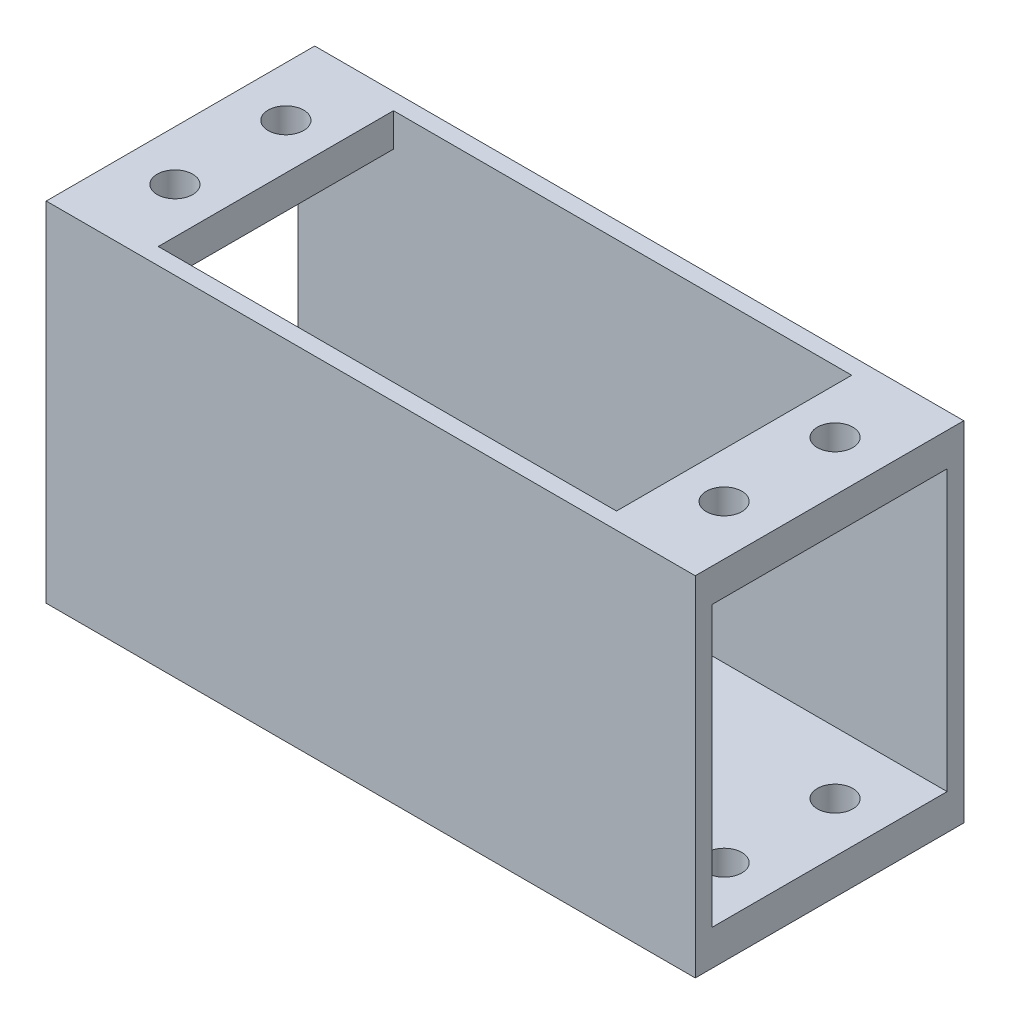
ISO-10303-21;
HEADER;
FILE_DESCRIPTION(('STEP AP214'),'2;1');
FILE_NAME('part.step','',(''),(''),'','','');
FILE_SCHEMA(('AUTOMOTIVE_DESIGN { 1 0 10303 214 1 1 1 1 }'));
ENDSEC;
DATA;
#1=APPLICATION_CONTEXT('core data for automotive mechanical design processes');
#2=APPLICATION_PROTOCOL_DEFINITION('international standard','automotive_design',2000,#1);
#3=PRODUCT_CONTEXT('',#1,'mechanical');
#4=PRODUCT('Part','Part','',(#3));
#5=PRODUCT_RELATED_PRODUCT_CATEGORY('part','',(#4));
#6=PRODUCT_DEFINITION_FORMATION('','',#4);
#7=PRODUCT_DEFINITION_CONTEXT('part definition',#1,'design');
#8=PRODUCT_DEFINITION('design','',#6,#7);
#9=PRODUCT_DEFINITION_SHAPE('','',#8);
#10=(LENGTH_UNIT() NAMED_UNIT(*) SI_UNIT(.MILLI.,.METRE.));
#11=(NAMED_UNIT(*) PLANE_ANGLE_UNIT() SI_UNIT($,.RADIAN.));
#12=(NAMED_UNIT(*) SI_UNIT($,.STERADIAN.) SOLID_ANGLE_UNIT());
#13=UNCERTAINTY_MEASURE_WITH_UNIT(LENGTH_MEASURE(1.E-05),#10,'distance_accuracy_value','');
#14=(GEOMETRIC_REPRESENTATION_CONTEXT(3) GLOBAL_UNCERTAINTY_ASSIGNED_CONTEXT((#13)) GLOBAL_UNIT_ASSIGNED_CONTEXT((#10,
#11,#12)) REPRESENTATION_CONTEXT('',''));
#15=CARTESIAN_POINT('',(0.,0.,0.));
#16=DIRECTION('',(0.,0.,1.));
#17=DIRECTION('',(1.,0.,0.));
#18=AXIS2_PLACEMENT_3D('',#15,#16,#17);
#19=CARTESIAN_POINT('',(-19.15,13.,10.6));
#20=DIRECTION('',(0.,0.,-1.));
#21=DIRECTION('',(-1.,0.,0.));
#22=AXIS2_PLACEMENT_3D('',#19,#20,#21);
#23=PLANE('',#22);
#24=DIRECTION('',(0.,-1.,0.));
#25=VECTOR('',#24,1.);
#26=CARTESIAN_POINT('',(4.45982062419555,-500.,10.6));
#27=LINE('',#26,#25);
#28=CARTESIAN_POINT('',(4.45982062419555,18.,10.6));
#29=VERTEX_POINT('',#28);
#30=CARTESIAN_POINT('',(4.45982062419555,13.,10.6));
#31=VERTEX_POINT('',#30);
#32=EDGE_CURVE('E211',#29,#31,#27,.T.);
#33=ORIENTED_EDGE('',*,*,#32,.F.);
#34=DIRECTION('',(1.,0.,0.));
#35=VECTOR('',#34,1.);
#36=CARTESIAN_POINT('',(-19.15,18.,10.6));
#37=LINE('',#36,#35);
#38=CARTESIAN_POINT('',(-4.45982062419555,18.,10.6));
#39=VERTEX_POINT('',#38);
#40=EDGE_CURVE('E337',#39,#29,#37,.T.);
#41=ORIENTED_EDGE('',*,*,#40,.F.);
#42=DIRECTION('',(0.,-1.,0.));
#43=VECTOR('',#42,1.);
#44=CARTESIAN_POINT('',(-4.45982062419555,-500.,10.6));
#45=LINE('',#44,#43);
#46=CARTESIAN_POINT('',(-4.45982062419555,13.,10.6));
#47=VERTEX_POINT('',#46);
#48=EDGE_CURVE('E332',#47,#39,#45,.F.);
#49=ORIENTED_EDGE('',*,*,#48,.F.);
#50=DIRECTION('',(1.,0.,0.));
#51=VECTOR('',#50,1.);
#52=CARTESIAN_POINT('',(-19.15,13.,10.6));
#53=LINE('',#52,#51);
#54=CARTESIAN_POINT('',(-19.15,13.,10.6));
#55=VERTEX_POINT('',#54);
#56=EDGE_CURVE('E185',#55,#47,#53,.T.);
#57=ORIENTED_EDGE('',*,*,#56,.F.);
#58=DIRECTION('',(0.,1.,0.));
#59=VECTOR('',#58,1.);
#60=CARTESIAN_POINT('',(-19.15,13.,10.6));
#61=LINE('',#60,#59);
#62=CARTESIAN_POINT('',(-19.15,38.2,10.6));
#63=VERTEX_POINT('',#62);
#64=EDGE_CURVE('E188',#55,#63,#61,.T.);
#65=ORIENTED_EDGE('',*,*,#64,.T.);
#66=DIRECTION('',(1.,0.,0.));
#67=VECTOR('',#66,1.);
#68=CARTESIAN_POINT('',(-19.15,38.2,10.6));
#69=LINE('',#68,#67);
#70=CARTESIAN_POINT('',(-10.55,38.2,10.6));
#71=VERTEX_POINT('',#70);
#72=EDGE_CURVE('E298',#63,#71,#69,.T.);
#73=ORIENTED_EDGE('',*,*,#72,.T.);
#74=DIRECTION('',(0.,1.,0.));
#75=VECTOR('',#74,1.);
#76=CARTESIAN_POINT('',(-10.55,38.2,10.6));
#77=LINE('',#76,#75);
#78=CARTESIAN_POINT('',(-10.55,41.2,10.6));
#79=VERTEX_POINT('',#78);
#80=EDGE_CURVE('E292',#71,#79,#77,.T.);
#81=ORIENTED_EDGE('',*,*,#80,.T.);
#82=DIRECTION('',(1.,0.,0.));
#83=VECTOR('',#82,1.);
#84=CARTESIAN_POINT('',(-19.15,41.2,10.6));
#85=LINE('',#84,#83);
#86=CARTESIAN_POINT('',(30.75,41.2,10.6));
#87=VERTEX_POINT('',#86);
#88=EDGE_CURVE('E216',#79,#87,#85,.T.);
#89=ORIENTED_EDGE('',*,*,#88,.T.);
#90=DIRECTION('',(0.,-1.,0.));
#91=VECTOR('',#90,1.);
#92=CARTESIAN_POINT('',(30.75,41.2,10.6));
#93=LINE('',#92,#91);
#94=CARTESIAN_POINT('',(30.75,38.2,10.6));
#95=VERTEX_POINT('',#94);
#96=EDGE_CURVE('E264',#87,#95,#93,.T.);
#97=ORIENTED_EDGE('',*,*,#96,.T.);
#98=DIRECTION('',(1.,0.,0.));
#99=VECTOR('',#98,1.);
#100=CARTESIAN_POINT('',(30.75,38.2,10.6));
#101=LINE('',#100,#99);
#102=CARTESIAN_POINT('',(39.35,38.2,10.6));
#103=VERTEX_POINT('',#102);
#104=EDGE_CURVE('E262',#95,#103,#101,.T.);
#105=ORIENTED_EDGE('',*,*,#104,.T.);
#106=DIRECTION('',(0.,1.,0.));
#107=VECTOR('',#106,1.);
#108=CARTESIAN_POINT('',(39.35,13.,10.6));
#109=LINE('',#108,#107);
#110=CARTESIAN_POINT('',(39.35,13.,10.6));
#111=VERTEX_POINT('',#110);
#112=EDGE_CURVE('E243',#111,#103,#109,.T.);
#113=ORIENTED_EDGE('',*,*,#112,.F.);
#114=EDGE_CURVE('E180',#31,#111,#53,.T.);
#115=ORIENTED_EDGE('',*,*,#114,.F.);
#116=EDGE_LOOP('',(#33,#41,#49,#57,#65,#73,#81,#89,#97,#105,#113,#115));
#117=FACE_BOUND('',#116,.T.);
#118=ADVANCED_FACE('F41',(#117),#23,.T.);
#119=CARTESIAN_POINT('',(-19.15,41.2,12.1));
#120=DIRECTION('',(0.,0.,1.));
#121=DIRECTION('',(1.,0.,0.));
#122=AXIS2_PLACEMENT_3D('',#119,#120,#121);
#123=PLANE('',#122);
#124=DIRECTION('',(1.,0.,0.));
#125=VECTOR('',#124,1.);
#126=CARTESIAN_POINT('',(-19.15,9.8,12.1));
#127=LINE('',#126,#125);
#128=CARTESIAN_POINT('',(-19.15,9.8,12.1));
#129=VERTEX_POINT('',#128);
#130=CARTESIAN_POINT('',(39.35,9.8,12.1));
#131=VERTEX_POINT('',#130);
#132=EDGE_CURVE('E189',#129,#131,#127,.T.);
#133=ORIENTED_EDGE('',*,*,#132,.T.);
#134=DIRECTION('',(0.,-1.,0.));
#135=VECTOR('',#134,1.);
#136=CARTESIAN_POINT('',(39.35,41.2,12.1));
#137=LINE('',#136,#135);
#138=CARTESIAN_POINT('',(39.35,41.2,12.1));
#139=VERTEX_POINT('',#138);
#140=EDGE_CURVE('E260',#139,#131,#137,.T.);
#141=ORIENTED_EDGE('',*,*,#140,.F.);
#142=DIRECTION('',(1.,0.,0.));
#143=VECTOR('',#142,1.);
#144=CARTESIAN_POINT('',(-19.15,41.2,12.1));
#145=LINE('',#144,#143);
#146=CARTESIAN_POINT('',(-19.15,41.2,12.1));
#147=VERTEX_POINT('',#146);
#148=EDGE_CURVE('E213',#147,#139,#145,.T.);
#149=ORIENTED_EDGE('',*,*,#148,.F.);
#150=DIRECTION('',(0.,-1.,0.));
#151=VECTOR('',#150,1.);
#152=CARTESIAN_POINT('',(-19.15,41.2,12.1));
#153=LINE('',#152,#151);
#154=EDGE_CURVE('E239',#147,#129,#153,.T.);
#155=ORIENTED_EDGE('',*,*,#154,.T.);
#156=EDGE_LOOP('',(#133,#141,#149,#155));
#157=FACE_BOUND('',#156,.T.);
#158=ADVANCED_FACE('F43',(#157),#123,.T.);
#159=CARTESIAN_POINT('',(-19.15,41.2,10.6));
#160=DIRECTION('',(0.,1.,0.));
#161=DIRECTION('',(0.,0.,1.));
#162=AXIS2_PLACEMENT_3D('',#159,#160,#161);
#163=PLANE('',#162);
#164=CARTESIAN_POINT('',(-14.65,41.2,-5.));
#165=DIRECTION('',(0.,1.,0.));
#166=DIRECTION('',(0.,0.,1.));
#167=AXIS2_PLACEMENT_3D('',#164,#165,#166);
#168=CIRCLE('',#167,1.6);
#169=CARTESIAN_POINT('',(-14.65,41.2,-3.4));
#170=VERTEX_POINT('',#169);
#171=EDGE_CURVE('E204',#170,#170,#168,.T.);
#172=ORIENTED_EDGE('',*,*,#171,.F.);
#173=EDGE_LOOP('',(#172));
#174=FACE_BOUND('',#173,.T.);
#175=CARTESIAN_POINT('',(34.85,41.2,5.));
#176=DIRECTION('',(0.,1.,0.));
#177=DIRECTION('',(0.,0.,1.));
#178=AXIS2_PLACEMENT_3D('',#175,#176,#177);
#179=CIRCLE('',#178,1.6);
#180=CARTESIAN_POINT('',(34.85,41.2,6.6));
#181=VERTEX_POINT('',#180);
#182=EDGE_CURVE('E285',#181,#181,#179,.T.);
#183=ORIENTED_EDGE('',*,*,#182,.F.);
#184=EDGE_LOOP('',(#183));
#185=FACE_BOUND('',#184,.T.);
#186=CARTESIAN_POINT('',(34.85,41.2,-5.));
#187=DIRECTION('',(0.,1.,0.));
#188=DIRECTION('',(0.,0.,1.));
#189=AXIS2_PLACEMENT_3D('',#186,#187,#188);
#190=CIRCLE('',#189,1.6);
#191=CARTESIAN_POINT('',(34.85,41.2,-3.4));
#192=VERTEX_POINT('',#191);
#193=EDGE_CURVE('E208',#192,#192,#190,.T.);
#194=ORIENTED_EDGE('',*,*,#193,.F.);
#195=EDGE_LOOP('',(#194));
#196=FACE_BOUND('',#195,.T.);
#197=CARTESIAN_POINT('',(-14.65,41.2,5.));
#198=DIRECTION('',(0.,1.,0.));
#199=DIRECTION('',(0.,0.,1.));
#200=AXIS2_PLACEMENT_3D('',#197,#198,#199);
#201=CIRCLE('',#200,1.6);
#202=CARTESIAN_POINT('',(-14.65,41.2,6.6));
#203=VERTEX_POINT('',#202);
#204=EDGE_CURVE('E197',#203,#203,#201,.T.);
#205=ORIENTED_EDGE('',*,*,#204,.F.);
#206=EDGE_LOOP('',(#205));
#207=FACE_BOUND('',#206,.T.);
#208=ORIENTED_EDGE('',*,*,#88,.F.);
#209=DIRECTION('',(0.,0.,-1.));
#210=VECTOR('',#209,1.);
#211=CARTESIAN_POINT('',(-10.55,41.2,10.6));
#212=LINE('',#211,#210);
#213=CARTESIAN_POINT('',(-10.55,41.2,-10.6));
#214=VERTEX_POINT('',#213);
#215=EDGE_CURVE('E287',#79,#214,#212,.T.);
#216=ORIENTED_EDGE('',*,*,#215,.T.);
#217=DIRECTION('',(1.,0.,0.));
#218=VECTOR('',#217,1.);
#219=CARTESIAN_POINT('',(-19.15,41.2,-10.6));
#220=LINE('',#219,#218);
#221=CARTESIAN_POINT('',(30.75,41.2,-10.6));
#222=VERTEX_POINT('',#221);
#223=EDGE_CURVE('E174',#214,#222,#220,.T.);
#224=ORIENTED_EDGE('',*,*,#223,.T.);
#225=DIRECTION('',(0.,0.,-1.));
#226=VECTOR('',#225,1.);
#227=CARTESIAN_POINT('',(30.75,41.2,10.6));
#228=LINE('',#227,#226);
#229=EDGE_CURVE('E266',#87,#222,#228,.T.);
#230=ORIENTED_EDGE('',*,*,#229,.F.);
#231=EDGE_LOOP('',(#208,#216,#224,#230));
#232=FACE_BOUND('',#231,.T.);
#233=ORIENTED_EDGE('',*,*,#148,.T.);
#234=DIRECTION('',(0.,0.,1.));
#235=VECTOR('',#234,1.);
#236=CARTESIAN_POINT('',(39.35,41.2,-12.1));
#237=LINE('',#236,#235);
#238=CARTESIAN_POINT('',(39.35,41.2,-12.1));
#239=VERTEX_POINT('',#238);
#240=EDGE_CURVE('E248',#239,#139,#237,.T.);
#241=ORIENTED_EDGE('',*,*,#240,.F.);
#242=DIRECTION('',(1.,0.,0.));
#243=VECTOR('',#242,1.);
#244=CARTESIAN_POINT('',(-19.15,41.2,-12.1));
#245=LINE('',#244,#243);
#246=CARTESIAN_POINT('',(-19.15,41.2,-12.1));
#247=VERTEX_POINT('',#246);
#248=EDGE_CURVE('E177',#247,#239,#245,.T.);
#249=ORIENTED_EDGE('',*,*,#248,.F.);
#250=DIRECTION('',(0.,0.,1.));
#251=VECTOR('',#250,1.);
#252=CARTESIAN_POINT('',(-19.15,41.2,-12.1));
#253=LINE('',#252,#251);
#254=EDGE_CURVE('E235',#247,#147,#253,.T.);
#255=ORIENTED_EDGE('',*,*,#254,.T.);
#256=EDGE_LOOP('',(#233,#241,#249,#255));
#257=FACE_BOUND('',#256,.T.);
#258=ADVANCED_FACE('F360',(#174,#185,#196,#207,#232,#257),#163,.T.);
#259=CARTESIAN_POINT('',(-19.15,13.,-10.6));
#260=DIRECTION('',(0.,1.,0.));
#261=DIRECTION('',(0.,0.,1.));
#262=AXIS2_PLACEMENT_3D('',#259,#260,#261);
#263=PLANE('',#262);
#264=ORIENTED_EDGE('',*,*,#56,.T.);
#265=CARTESIAN_POINT('',(0.,13.,0.));
#266=DIRECTION('',(0.,-1.,0.));
#267=DIRECTION('',(0.,0.,-1.));
#268=AXIS2_PLACEMENT_3D('',#265,#266,#267);
#269=CIRCLE('',#268,11.5);
#270=EDGE_CURVE('E163',#31,#47,#269,.T.);
#271=ORIENTED_EDGE('',*,*,#270,.F.);
#272=ORIENTED_EDGE('',*,*,#114,.T.);
#273=DIRECTION('',(0.,0.,1.));
#274=VECTOR('',#273,1.);
#275=CARTESIAN_POINT('',(39.35,13.,-10.6));
#276=LINE('',#275,#274);
#277=CARTESIAN_POINT('',(39.35,13.,-10.6));
#278=VERTEX_POINT('',#277);
#279=EDGE_CURVE('E173',#278,#111,#276,.T.);
#280=ORIENTED_EDGE('',*,*,#279,.F.);
#281=DIRECTION('',(1.,0.,0.));
#282=VECTOR('',#281,1.);
#283=CARTESIAN_POINT('',(-19.15,13.,-10.6));
#284=LINE('',#283,#282);
#285=CARTESIAN_POINT('',(4.45982062419555,13.,-10.6));
#286=VERTEX_POINT('',#285);
#287=EDGE_CURVE('E164',#286,#278,#284,.T.);
#288=ORIENTED_EDGE('',*,*,#287,.F.);
#289=CARTESIAN_POINT('',(-4.45982062419555,13.,-10.6));
#290=VERTEX_POINT('',#289);
#291=EDGE_CURVE('E151',#290,#286,#269,.T.);
#292=ORIENTED_EDGE('',*,*,#291,.F.);
#293=CARTESIAN_POINT('',(-19.15,13.,-10.6));
#294=VERTEX_POINT('',#293);
#295=EDGE_CURVE('E172',#294,#290,#284,.T.);
#296=ORIENTED_EDGE('',*,*,#295,.F.);
#297=DIRECTION('',(0.,0.,1.));
#298=VECTOR('',#297,1.);
#299=CARTESIAN_POINT('',(-19.15,13.,-10.6));
#300=LINE('',#299,#298);
#301=EDGE_CURVE('E227',#294,#55,#300,.T.);
#302=ORIENTED_EDGE('',*,*,#301,.T.);
#303=EDGE_LOOP('',(#264,#271,#272,#280,#288,#292,#296,#302));
#304=FACE_BOUND('',#303,.T.);
#305=CARTESIAN_POINT('',(-14.65,13.,-5.));
#306=DIRECTION('',(0.,1.,0.));
#307=DIRECTION('',(0.,0.,1.));
#308=AXIS2_PLACEMENT_3D('',#305,#306,#307);
#309=CIRCLE('',#308,1.6);
#310=CARTESIAN_POINT('',(-14.65,13.,-3.4));
#311=VERTEX_POINT('',#310);
#312=EDGE_CURVE('E316',#311,#311,#309,.T.);
#313=ORIENTED_EDGE('',*,*,#312,.F.);
#314=EDGE_LOOP('',(#313));
#315=FACE_BOUND('',#314,.T.);
#316=CARTESIAN_POINT('',(-14.65,13.,5.));
#317=DIRECTION('',(0.,1.,0.));
#318=DIRECTION('',(0.,0.,1.));
#319=AXIS2_PLACEMENT_3D('',#316,#317,#318);
#320=CIRCLE('',#319,1.6);
#321=CARTESIAN_POINT('',(-14.65,13.,6.6));
#322=VERTEX_POINT('',#321);
#323=EDGE_CURVE('E329',#322,#322,#320,.T.);
#324=ORIENTED_EDGE('',*,*,#323,.F.);
#325=EDGE_LOOP('',(#324));
#326=FACE_BOUND('',#325,.T.);
#327=CARTESIAN_POINT('',(0.,13.,0.));
#328=DIRECTION('',(0.,1.,0.));
#329=DIRECTION('',(0.,0.,1.));
#330=AXIS2_PLACEMENT_3D('',#327,#328,#329);
#331=CIRCLE('',#330,7.7);
#332=CARTESIAN_POINT('',(0.,13.,7.7));
#333=VERTEX_POINT('',#332);
#334=EDGE_CURVE('E193',#333,#333,#331,.T.);
#335=ORIENTED_EDGE('',*,*,#334,.F.);
#336=EDGE_LOOP('',(#335));
#337=FACE_BOUND('',#336,.T.);
#338=CARTESIAN_POINT('',(34.85,13.,-5.));
#339=DIRECTION('',(0.,1.,0.));
#340=DIRECTION('',(0.,0.,1.));
#341=AXIS2_PLACEMENT_3D('',#338,#339,#340);
#342=CIRCLE('',#341,1.6);
#343=CARTESIAN_POINT('',(34.85,13.,-3.4));
#344=VERTEX_POINT('',#343);
#345=EDGE_CURVE('E315',#344,#344,#342,.T.);
#346=ORIENTED_EDGE('',*,*,#345,.F.);
#347=EDGE_LOOP('',(#346));
#348=FACE_BOUND('',#347,.T.);
#349=CARTESIAN_POINT('',(34.85,13.,5.));
#350=DIRECTION('',(0.,1.,0.));
#351=DIRECTION('',(0.,0.,1.));
#352=AXIS2_PLACEMENT_3D('',#349,#350,#351);
#353=CIRCLE('',#352,1.6);
#354=CARTESIAN_POINT('',(34.85,13.,6.6));
#355=VERTEX_POINT('',#354);
#356=EDGE_CURVE('E304',#355,#355,#353,.T.);
#357=ORIENTED_EDGE('',*,*,#356,.F.);
#358=EDGE_LOOP('',(#357));
#359=FACE_BOUND('',#358,.T.);
#360=ADVANCED_FACE('F167',(#304,#315,#326,#337,#348,#359),#263,.T.);
#361=CARTESIAN_POINT('',(-19.15,41.2,-10.6));
#362=DIRECTION('',(0.,0.,1.));
#363=DIRECTION('',(1.,0.,0.));
#364=AXIS2_PLACEMENT_3D('',#361,#362,#363);
#365=PLANE('',#364);
#366=DIRECTION('',(0.,-1.,0.));
#367=VECTOR('',#366,1.);
#368=CARTESIAN_POINT('',(-4.45982062419555,-500.,-10.6));
#369=LINE('',#368,#367);
#370=CARTESIAN_POINT('',(-4.45982062419555,18.,-10.6));
#371=VERTEX_POINT('',#370);
#372=EDGE_CURVE('E11',#371,#290,#369,.T.);
#373=ORIENTED_EDGE('',*,*,#372,.F.);
#374=DIRECTION('',(-1.,0.,0.));
#375=VECTOR('',#374,1.);
#376=CARTESIAN_POINT('',(-19.15,18.,-10.6));
#377=LINE('',#376,#375);
#378=CARTESIAN_POINT('',(4.45982062419555,18.,-10.6));
#379=VERTEX_POINT('',#378);
#380=EDGE_CURVE('E170',#379,#371,#377,.T.);
#381=ORIENTED_EDGE('',*,*,#380,.F.);
#382=DIRECTION('',(0.,-1.,0.));
#383=VECTOR('',#382,1.);
#384=CARTESIAN_POINT('',(4.45982062419555,-500.,-10.6));
#385=LINE('',#384,#383);
#386=EDGE_CURVE('E47',#286,#379,#385,.F.);
#387=ORIENTED_EDGE('',*,*,#386,.F.);
#388=ORIENTED_EDGE('',*,*,#287,.T.);
#389=DIRECTION('',(0.,-1.,0.));
#390=VECTOR('',#389,1.);
#391=CARTESIAN_POINT('',(39.35,41.2,-10.6));
#392=LINE('',#391,#390);
#393=CARTESIAN_POINT('',(39.35,38.2,-10.6));
#394=VERTEX_POINT('',#393);
#395=EDGE_CURVE('E250',#394,#278,#392,.T.);
#396=ORIENTED_EDGE('',*,*,#395,.F.);
#397=DIRECTION('',(1.,0.,0.));
#398=VECTOR('',#397,1.);
#399=CARTESIAN_POINT('',(30.75,38.2,-10.6));
#400=LINE('',#399,#398);
#401=CARTESIAN_POINT('',(30.75,38.2,-10.6));
#402=VERTEX_POINT('',#401);
#403=EDGE_CURVE('E263',#402,#394,#400,.T.);
#404=ORIENTED_EDGE('',*,*,#403,.F.);
#405=DIRECTION('',(0.,-1.,0.));
#406=VECTOR('',#405,1.);
#407=CARTESIAN_POINT('',(30.75,41.2,-10.6));
#408=LINE('',#407,#406);
#409=EDGE_CURVE('E267',#222,#402,#408,.T.);
#410=ORIENTED_EDGE('',*,*,#409,.F.);
#411=ORIENTED_EDGE('',*,*,#223,.F.);
#412=DIRECTION('',(0.,1.,0.));
#413=VECTOR('',#412,1.);
#414=CARTESIAN_POINT('',(-10.55,38.2,-10.6));
#415=LINE('',#414,#413);
#416=CARTESIAN_POINT('',(-10.55,38.2,-10.6));
#417=VERTEX_POINT('',#416);
#418=EDGE_CURVE('E291',#417,#214,#415,.T.);
#419=ORIENTED_EDGE('',*,*,#418,.F.);
#420=DIRECTION('',(1.,0.,0.));
#421=VECTOR('',#420,1.);
#422=CARTESIAN_POINT('',(-19.15,38.2,-10.6));
#423=LINE('',#422,#421);
#424=CARTESIAN_POINT('',(-19.15,38.2,-10.6));
#425=VERTEX_POINT('',#424);
#426=EDGE_CURVE('E275',#425,#417,#423,.T.);
#427=ORIENTED_EDGE('',*,*,#426,.F.);
#428=DIRECTION('',(0.,-1.,0.));
#429=VECTOR('',#428,1.);
#430=CARTESIAN_POINT('',(-19.15,41.2,-10.6));
#431=LINE('',#430,#429);
#432=EDGE_CURVE('E229',#425,#294,#431,.T.);
#433=ORIENTED_EDGE('',*,*,#432,.T.);
#434=ORIENTED_EDGE('',*,*,#295,.T.);
#435=EDGE_LOOP('',(#373,#381,#387,#388,#396,#404,#410,#411,#419,#427,#433,#434));
#436=FACE_BOUND('',#435,.T.);
#437=ADVANCED_FACE('F165',(#436),#365,.T.);
#438=CARTESIAN_POINT('',(-19.15,9.8,-12.1));
#439=DIRECTION('',(0.,0.,-1.));
#440=DIRECTION('',(-1.,0.,0.));
#441=AXIS2_PLACEMENT_3D('',#438,#439,#440);
#442=PLANE('',#441);
#443=ORIENTED_EDGE('',*,*,#248,.T.);
#444=DIRECTION('',(0.,1.,0.));
#445=VECTOR('',#444,1.);
#446=CARTESIAN_POINT('',(39.35,9.8,-12.1));
#447=LINE('',#446,#445);
#448=CARTESIAN_POINT('',(39.35,9.8,-12.1));
#449=VERTEX_POINT('',#448);
#450=EDGE_CURVE('E252',#449,#239,#447,.T.);
#451=ORIENTED_EDGE('',*,*,#450,.F.);
#452=DIRECTION('',(1.,0.,0.));
#453=VECTOR('',#452,1.);
#454=CARTESIAN_POINT('',(-19.15,9.8,-12.1));
#455=LINE('',#454,#453);
#456=CARTESIAN_POINT('',(-19.15,9.8,-12.1));
#457=VERTEX_POINT('',#456);
#458=EDGE_CURVE('E187',#457,#449,#455,.T.);
#459=ORIENTED_EDGE('',*,*,#458,.F.);
#460=DIRECTION('',(0.,1.,0.));
#461=VECTOR('',#460,1.);
#462=CARTESIAN_POINT('',(-19.15,9.8,-12.1));
#463=LINE('',#462,#461);
#464=EDGE_CURVE('E234',#457,#247,#463,.T.);
#465=ORIENTED_EDGE('',*,*,#464,.T.);
#466=EDGE_LOOP('',(#443,#451,#459,#465));
#467=FACE_BOUND('',#466,.T.);
#468=ADVANCED_FACE('F385',(#467),#442,.T.);
#469=CARTESIAN_POINT('',(-19.15,9.8,12.1));
#470=DIRECTION('',(0.,-1.,0.));
#471=DIRECTION('',(0.,0.,-1.));
#472=AXIS2_PLACEMENT_3D('',#469,#470,#471);
#473=PLANE('',#472);
#474=CARTESIAN_POINT('',(0.,9.8,0.));
#475=DIRECTION('',(0.,-1.,0.));
#476=DIRECTION('',(0.,0.,-1.));
#477=AXIS2_PLACEMENT_3D('',#474,#475,#476);
#478=CIRCLE('',#477,7.7);
#479=CARTESIAN_POINT('',(0.,9.8,-7.7));
#480=VERTEX_POINT('',#479);
#481=EDGE_CURVE('E212',#480,#480,#478,.T.);
#482=ORIENTED_EDGE('',*,*,#481,.F.);
#483=EDGE_LOOP('',(#482));
#484=FACE_BOUND('',#483,.T.);
#485=CARTESIAN_POINT('',(-14.65,9.8,-5.));
#486=DIRECTION('',(0.,-1.,0.));
#487=DIRECTION('',(0.,0.,-1.));
#488=AXIS2_PLACEMENT_3D('',#485,#486,#487);
#489=CIRCLE('',#488,1.6);
#490=CARTESIAN_POINT('',(-14.65,9.8,-6.6));
#491=VERTEX_POINT('',#490);
#492=EDGE_CURVE('E198',#491,#491,#489,.T.);
#493=ORIENTED_EDGE('',*,*,#492,.F.);
#494=EDGE_LOOP('',(#493));
#495=FACE_BOUND('',#494,.T.);
#496=CARTESIAN_POINT('',(34.85,9.8,5.));
#497=DIRECTION('',(0.,-1.,0.));
#498=DIRECTION('',(0.,0.,-1.));
#499=AXIS2_PLACEMENT_3D('',#496,#497,#498);
#500=CIRCLE('',#499,1.6);
#501=CARTESIAN_POINT('',(34.85,9.8,3.4));
#502=VERTEX_POINT('',#501);
#503=EDGE_CURVE('E209',#502,#502,#500,.T.);
#504=ORIENTED_EDGE('',*,*,#503,.F.);
#505=EDGE_LOOP('',(#504));
#506=FACE_BOUND('',#505,.T.);
#507=CARTESIAN_POINT('',(34.85,9.8,-5.));
#508=DIRECTION('',(0.,-1.,0.));
#509=DIRECTION('',(0.,0.,-1.));
#510=AXIS2_PLACEMENT_3D('',#507,#508,#509);
#511=CIRCLE('',#510,1.6);
#512=CARTESIAN_POINT('',(34.85,9.8,-6.6));
#513=VERTEX_POINT('',#512);
#514=EDGE_CURVE('E202',#513,#513,#511,.T.);
#515=ORIENTED_EDGE('',*,*,#514,.F.);
#516=EDGE_LOOP('',(#515));
#517=FACE_BOUND('',#516,.T.);
#518=CARTESIAN_POINT('',(-14.65,9.8,5.));
#519=DIRECTION('',(0.,-1.,0.));
#520=DIRECTION('',(0.,0.,-1.));
#521=AXIS2_PLACEMENT_3D('',#518,#519,#520);
#522=CIRCLE('',#521,1.6);
#523=CARTESIAN_POINT('',(-14.65,9.8,3.4));
#524=VERTEX_POINT('',#523);
#525=EDGE_CURVE('E191',#524,#524,#522,.T.);
#526=ORIENTED_EDGE('',*,*,#525,.F.);
#527=EDGE_LOOP('',(#526));
#528=FACE_BOUND('',#527,.T.);
#529=ORIENTED_EDGE('',*,*,#458,.T.);
#530=DIRECTION('',(0.,0.,-1.));
#531=VECTOR('',#530,1.);
#532=CARTESIAN_POINT('',(39.35,9.8,12.1));
#533=LINE('',#532,#531);
#534=EDGE_CURVE('E251',#131,#449,#533,.T.);
#535=ORIENTED_EDGE('',*,*,#534,.F.);
#536=ORIENTED_EDGE('',*,*,#132,.F.);
#537=DIRECTION('',(0.,0.,-1.));
#538=VECTOR('',#537,1.);
#539=CARTESIAN_POINT('',(-19.15,9.8,12.1));
#540=LINE('',#539,#538);
#541=EDGE_CURVE('E240',#129,#457,#540,.T.);
#542=ORIENTED_EDGE('',*,*,#541,.T.);
#543=EDGE_LOOP('',(#529,#535,#536,#542));
#544=FACE_BOUND('',#543,.T.);
#545=ADVANCED_FACE('F371',(#484,#495,#506,#517,#528,#544),#473,.T.);
#546=CARTESIAN_POINT('',(-19.15,0.,0.));
#547=DIRECTION('',(1.,0.,0.));
#548=DIRECTION('',(0.,0.,-1.));
#549=AXIS2_PLACEMENT_3D('',#546,#547,#548);
#550=PLANE('',#549);
#551=DIRECTION('',(0.,0.,-1.));
#552=VECTOR('',#551,1.);
#553=CARTESIAN_POINT('',(-19.15,38.2,10.6));
#554=LINE('',#553,#552);
#555=EDGE_CURVE('E258',#63,#425,#554,.T.);
#556=ORIENTED_EDGE('',*,*,#555,.F.);
#557=ORIENTED_EDGE('',*,*,#64,.F.);
#558=ORIENTED_EDGE('',*,*,#301,.F.);
#559=ORIENTED_EDGE('',*,*,#432,.F.);
#560=EDGE_LOOP('',(#556,#557,#558,#559));
#561=FACE_BOUND('',#560,.T.);
#562=ORIENTED_EDGE('',*,*,#154,.F.);
#563=ORIENTED_EDGE('',*,*,#254,.F.);
#564=ORIENTED_EDGE('',*,*,#464,.F.);
#565=ORIENTED_EDGE('',*,*,#541,.F.);
#566=EDGE_LOOP('',(#562,#563,#564,#565));
#567=FACE_BOUND('',#566,.T.);
#568=ADVANCED_FACE('F368',(#561,#567),#550,.F.);
#569=CARTESIAN_POINT('',(39.35,0.,0.));
#570=DIRECTION('',(1.,0.,0.));
#571=DIRECTION('',(0.,0.,-1.));
#572=AXIS2_PLACEMENT_3D('',#569,#570,#571);
#573=PLANE('',#572);
#574=ORIENTED_EDGE('',*,*,#240,.T.);
#575=ORIENTED_EDGE('',*,*,#140,.T.);
#576=ORIENTED_EDGE('',*,*,#534,.T.);
#577=ORIENTED_EDGE('',*,*,#450,.T.);
#578=EDGE_LOOP('',(#574,#575,#576,#577));
#579=FACE_BOUND('',#578,.T.);
#580=ORIENTED_EDGE('',*,*,#112,.T.);
#581=DIRECTION('',(0.,0.,-1.));
#582=VECTOR('',#581,1.);
#583=CARTESIAN_POINT('',(39.35,38.2,10.6));
#584=LINE('',#583,#582);
#585=EDGE_CURVE('E280',#103,#394,#584,.T.);
#586=ORIENTED_EDGE('',*,*,#585,.T.);
#587=ORIENTED_EDGE('',*,*,#395,.T.);
#588=ORIENTED_EDGE('',*,*,#279,.T.);
#589=EDGE_LOOP('',(#580,#586,#587,#588));
#590=FACE_BOUND('',#589,.T.);
#591=ADVANCED_FACE('F347',(#579,#590),#573,.T.);
#592=CARTESIAN_POINT('',(30.75,41.2,10.6));
#593=DIRECTION('',(1.,0.,0.));
#594=DIRECTION('',(0.,0.,-1.));
#595=AXIS2_PLACEMENT_3D('',#592,#593,#594);
#596=PLANE('',#595);
#597=ORIENTED_EDGE('',*,*,#409,.T.);
#598=DIRECTION('',(0.,0.,-1.));
#599=VECTOR('',#598,1.);
#600=CARTESIAN_POINT('',(30.75,38.2,10.6));
#601=LINE('',#600,#599);
#602=EDGE_CURVE('E278',#95,#402,#601,.T.);
#603=ORIENTED_EDGE('',*,*,#602,.F.);
#604=ORIENTED_EDGE('',*,*,#96,.F.);
#605=ORIENTED_EDGE('',*,*,#229,.T.);
#606=EDGE_LOOP('',(#597,#603,#604,#605));
#607=FACE_BOUND('',#606,.T.);
#608=ADVANCED_FACE('F358',(#607),#596,.F.);
#609=CARTESIAN_POINT('',(30.75,38.2,10.6));
#610=DIRECTION('',(0.,1.,0.));
#611=DIRECTION('',(0.,0.,1.));
#612=AXIS2_PLACEMENT_3D('',#609,#610,#611);
#613=PLANE('',#612);
#614=CARTESIAN_POINT('',(34.85,38.2,5.));
#615=DIRECTION('',(0.,1.,0.));
#616=DIRECTION('',(0.,0.,1.));
#617=AXIS2_PLACEMENT_3D('',#614,#615,#616);
#618=CIRCLE('',#617,1.6);
#619=CARTESIAN_POINT('',(34.85,38.2,6.6));
#620=VERTEX_POINT('',#619);
#621=EDGE_CURVE('E207',#620,#620,#618,.T.);
#622=ORIENTED_EDGE('',*,*,#621,.T.);
#623=EDGE_LOOP('',(#622));
#624=FACE_BOUND('',#623,.T.);
#625=CARTESIAN_POINT('',(34.85,38.2,-5.));
#626=DIRECTION('',(0.,1.,0.));
#627=DIRECTION('',(0.,0.,1.));
#628=AXIS2_PLACEMENT_3D('',#625,#626,#627);
#629=CIRCLE('',#628,1.6);
#630=CARTESIAN_POINT('',(34.85,38.2,-3.4));
#631=VERTEX_POINT('',#630);
#632=EDGE_CURVE('E203',#631,#631,#629,.T.);
#633=ORIENTED_EDGE('',*,*,#632,.T.);
#634=EDGE_LOOP('',(#633));
#635=FACE_BOUND('',#634,.T.);
#636=ORIENTED_EDGE('',*,*,#403,.T.);
#637=ORIENTED_EDGE('',*,*,#585,.F.);
#638=ORIENTED_EDGE('',*,*,#104,.F.);
#639=ORIENTED_EDGE('',*,*,#602,.T.);
#640=EDGE_LOOP('',(#636,#637,#638,#639));
#641=FACE_BOUND('',#640,.T.);
#642=ADVANCED_FACE('F352',(#624,#635,#641),#613,.F.);
#643=CARTESIAN_POINT('',(-19.15,38.2,10.6));
#644=DIRECTION('',(0.,1.,0.));
#645=DIRECTION('',(0.,0.,1.));
#646=AXIS2_PLACEMENT_3D('',#643,#644,#645);
#647=PLANE('',#646);
#648=CARTESIAN_POINT('',(-14.65,38.2,-5.));
#649=DIRECTION('',(0.,1.,0.));
#650=DIRECTION('',(0.,0.,1.));
#651=AXIS2_PLACEMENT_3D('',#648,#649,#650);
#652=CIRCLE('',#651,1.6);
#653=CARTESIAN_POINT('',(-14.65,38.2,-3.4));
#654=VERTEX_POINT('',#653);
#655=EDGE_CURVE('E199',#654,#654,#652,.T.);
#656=ORIENTED_EDGE('',*,*,#655,.T.);
#657=EDGE_LOOP('',(#656));
#658=FACE_BOUND('',#657,.T.);
#659=CARTESIAN_POINT('',(-14.65,38.2,5.));
#660=DIRECTION('',(0.,1.,0.));
#661=DIRECTION('',(0.,0.,1.));
#662=AXIS2_PLACEMENT_3D('',#659,#660,#661);
#663=CIRCLE('',#662,1.6);
#664=CARTESIAN_POINT('',(-14.65,38.2,6.6));
#665=VERTEX_POINT('',#664);
#666=EDGE_CURVE('E192',#665,#665,#663,.T.);
#667=ORIENTED_EDGE('',*,*,#666,.T.);
#668=EDGE_LOOP('',(#667));
#669=FACE_BOUND('',#668,.T.);
#670=ORIENTED_EDGE('',*,*,#426,.T.);
#671=DIRECTION('',(0.,0.,-1.));
#672=VECTOR('',#671,1.);
#673=CARTESIAN_POINT('',(-10.55,38.2,10.6));
#674=LINE('',#673,#672);
#675=EDGE_CURVE('E288',#71,#417,#674,.T.);
#676=ORIENTED_EDGE('',*,*,#675,.F.);
#677=ORIENTED_EDGE('',*,*,#72,.F.);
#678=ORIENTED_EDGE('',*,*,#555,.T.);
#679=EDGE_LOOP('',(#670,#676,#677,#678));
#680=FACE_BOUND('',#679,.T.);
#681=ADVANCED_FACE('F362',(#658,#669,#680),#647,.F.);
#682=CARTESIAN_POINT('',(-10.55,38.2,10.6));
#683=DIRECTION('',(-1.,0.,0.));
#684=DIRECTION('',(0.,0.,1.));
#685=AXIS2_PLACEMENT_3D('',#682,#683,#684);
#686=PLANE('',#685);
#687=ORIENTED_EDGE('',*,*,#418,.T.);
#688=ORIENTED_EDGE('',*,*,#215,.F.);
#689=ORIENTED_EDGE('',*,*,#80,.F.);
#690=ORIENTED_EDGE('',*,*,#675,.T.);
#691=EDGE_LOOP('',(#687,#688,#689,#690));
#692=FACE_BOUND('',#691,.T.);
#693=ADVANCED_FACE('F365',(#692),#686,.F.);
#694=CARTESIAN_POINT('',(-14.65,-51.2,5.));
#695=DIRECTION('',(0.,1.,0.));
#696=DIRECTION('',(0.,0.,1.));
#697=AXIS2_PLACEMENT_3D('',#694,#695,#696);
#698=CYLINDRICAL_SURFACE('',#697,1.6);
#699=ORIENTED_EDGE('',*,*,#204,.T.);
#700=EDGE_LOOP('',(#699));
#701=FACE_BOUND('',#700,.T.);
#702=ORIENTED_EDGE('',*,*,#666,.F.);
#703=EDGE_LOOP('',(#702));
#704=FACE_BOUND('',#703,.T.);
#705=ADVANCED_FACE('F489',(#701,#704),#698,.F.);
#706=CARTESIAN_POINT('',(-14.65,-51.2,-5.));
#707=DIRECTION('',(0.,1.,0.));
#708=DIRECTION('',(0.,0.,1.));
#709=AXIS2_PLACEMENT_3D('',#706,#707,#708);
#710=CYLINDRICAL_SURFACE('',#709,1.6);
#711=ORIENTED_EDGE('',*,*,#171,.T.);
#712=EDGE_LOOP('',(#711));
#713=FACE_BOUND('',#712,.T.);
#714=ORIENTED_EDGE('',*,*,#655,.F.);
#715=EDGE_LOOP('',(#714));
#716=FACE_BOUND('',#715,.T.);
#717=ADVANCED_FACE('F463',(#713,#716),#710,.F.);
#718=CARTESIAN_POINT('',(34.85,-51.2,-5.));
#719=DIRECTION('',(0.,1.,0.));
#720=DIRECTION('',(0.,0.,1.));
#721=AXIS2_PLACEMENT_3D('',#718,#719,#720);
#722=CYLINDRICAL_SURFACE('',#721,1.6);
#723=ORIENTED_EDGE('',*,*,#193,.T.);
#724=EDGE_LOOP('',(#723));
#725=FACE_BOUND('',#724,.T.);
#726=ORIENTED_EDGE('',*,*,#632,.F.);
#727=EDGE_LOOP('',(#726));
#728=FACE_BOUND('',#727,.T.);
#729=ADVANCED_FACE('F483',(#725,#728),#722,.F.);
#730=CARTESIAN_POINT('',(34.85,-51.2,5.));
#731=DIRECTION('',(0.,1.,0.));
#732=DIRECTION('',(0.,0.,1.));
#733=AXIS2_PLACEMENT_3D('',#730,#731,#732);
#734=CYLINDRICAL_SURFACE('',#733,1.6);
#735=ORIENTED_EDGE('',*,*,#182,.T.);
#736=EDGE_LOOP('',(#735));
#737=FACE_BOUND('',#736,.T.);
#738=ORIENTED_EDGE('',*,*,#621,.F.);
#739=EDGE_LOOP('',(#738));
#740=FACE_BOUND('',#739,.T.);
#741=ADVANCED_FACE('F472',(#737,#740),#734,.F.);
#742=ORIENTED_EDGE('',*,*,#323,.T.);
#743=EDGE_LOOP('',(#742));
#744=FACE_BOUND('',#743,.T.);
#745=ORIENTED_EDGE('',*,*,#525,.T.);
#746=EDGE_LOOP('',(#745));
#747=FACE_BOUND('',#746,.T.);
#748=ADVANCED_FACE('F480',(#744,#747),#698,.F.);
#749=ORIENTED_EDGE('',*,*,#345,.T.);
#750=EDGE_LOOP('',(#749));
#751=FACE_BOUND('',#750,.T.);
#752=ORIENTED_EDGE('',*,*,#514,.T.);
#753=EDGE_LOOP('',(#752));
#754=FACE_BOUND('',#753,.T.);
#755=ADVANCED_FACE('F466',(#751,#754),#722,.F.);
#756=ORIENTED_EDGE('',*,*,#356,.T.);
#757=EDGE_LOOP('',(#756));
#758=FACE_BOUND('',#757,.T.);
#759=ORIENTED_EDGE('',*,*,#503,.T.);
#760=EDGE_LOOP('',(#759));
#761=FACE_BOUND('',#760,.T.);
#762=ADVANCED_FACE('F460',(#758,#761),#734,.F.);
#763=ORIENTED_EDGE('',*,*,#312,.T.);
#764=EDGE_LOOP('',(#763));
#765=FACE_BOUND('',#764,.T.);
#766=ORIENTED_EDGE('',*,*,#492,.T.);
#767=EDGE_LOOP('',(#766));
#768=FACE_BOUND('',#767,.T.);
#769=ADVANCED_FACE('F448',(#765,#768),#710,.F.);
#770=CARTESIAN_POINT('',(0.,-14.,0.));
#771=DIRECTION('',(0.,1.,0.));
#772=DIRECTION('',(0.,0.,1.));
#773=AXIS2_PLACEMENT_3D('',#770,#771,#772);
#774=CYLINDRICAL_SURFACE('',#773,7.7);
#775=ORIENTED_EDGE('',*,*,#334,.T.);
#776=EDGE_LOOP('',(#775));
#777=FACE_BOUND('',#776,.T.);
#778=ORIENTED_EDGE('',*,*,#481,.T.);
#779=EDGE_LOOP('',(#778));
#780=FACE_BOUND('',#779,.T.);
#781=ADVANCED_FACE('F416',(#777,#780),#774,.F.);
#782=CARTESIAN_POINT('',(11.5,18.,0.));
#783=DIRECTION('',(0.,1.,0.));
#784=DIRECTION('',(0.,0.,1.));
#785=AXIS2_PLACEMENT_3D('',#782,#783,#784);
#786=PLANE('',#785);
#787=ORIENTED_EDGE('',*,*,#380,.T.);
#788=CARTESIAN_POINT('',(0.,18.,0.));
#789=DIRECTION('',(0.,-1.,0.));
#790=DIRECTION('',(0.,0.,-1.));
#791=AXIS2_PLACEMENT_3D('',#788,#789,#790);
#792=CIRCLE('',#791,11.5);
#793=EDGE_CURVE('E65',#371,#379,#792,.T.);
#794=ORIENTED_EDGE('',*,*,#793,.T.);
#795=EDGE_LOOP('',(#787,#794));
#796=FACE_BOUND('',#795,.T.);
#797=ADVANCED_FACE('F413',(#796),#786,.F.);
#798=CARTESIAN_POINT('',(0.,-500.,0.));
#799=DIRECTION('',(0.,-1.,0.));
#800=DIRECTION('',(0.,0.,-1.));
#801=AXIS2_PLACEMENT_3D('',#798,#799,#800);
#802=CYLINDRICAL_SURFACE('',#801,11.5);
#803=ORIENTED_EDGE('',*,*,#372,.T.);
#804=ORIENTED_EDGE('',*,*,#291,.T.);
#805=ORIENTED_EDGE('',*,*,#386,.T.);
#806=ORIENTED_EDGE('',*,*,#793,.F.);
#807=EDGE_LOOP('',(#803,#804,#805,#806));
#808=FACE_BOUND('',#807,.T.);
#809=ADVANCED_FACE('F153',(#808),#802,.F.);
#810=ORIENTED_EDGE('',*,*,#32,.T.);
#811=ORIENTED_EDGE('',*,*,#270,.T.);
#812=ORIENTED_EDGE('',*,*,#48,.T.);
#813=EDGE_CURVE('E54',#29,#39,#792,.T.);
#814=ORIENTED_EDGE('',*,*,#813,.F.);
#815=EDGE_LOOP('',(#810,#811,#812,#814));
#816=FACE_BOUND('',#815,.T.);
#817=ADVANCED_FACE('F345',(#816),#802,.F.);
#818=ORIENTED_EDGE('',*,*,#40,.T.);
#819=ORIENTED_EDGE('',*,*,#813,.T.);
#820=EDGE_LOOP('',(#818,#819));
#821=FACE_BOUND('',#820,.T.);
#822=ADVANCED_FACE('F419',(#821),#786,.F.);
#823=CLOSED_SHELL('',(#118,#158,#258,#360,#437,#468,#545,#568,#591,#608,#642,#681,#693,#705,
#717,#729,#741,#748,#755,#762,#769,#781,#797,#809,#817,#822));
#824=MANIFOLD_SOLID_BREP('B2',#823);
#825=ADVANCED_BREP_SHAPE_REPRESENTATION('',(#18,#824),#14);
#826=SHAPE_DEFINITION_REPRESENTATION(#9,#825);
ENDSEC;
END-ISO-10303-21;
